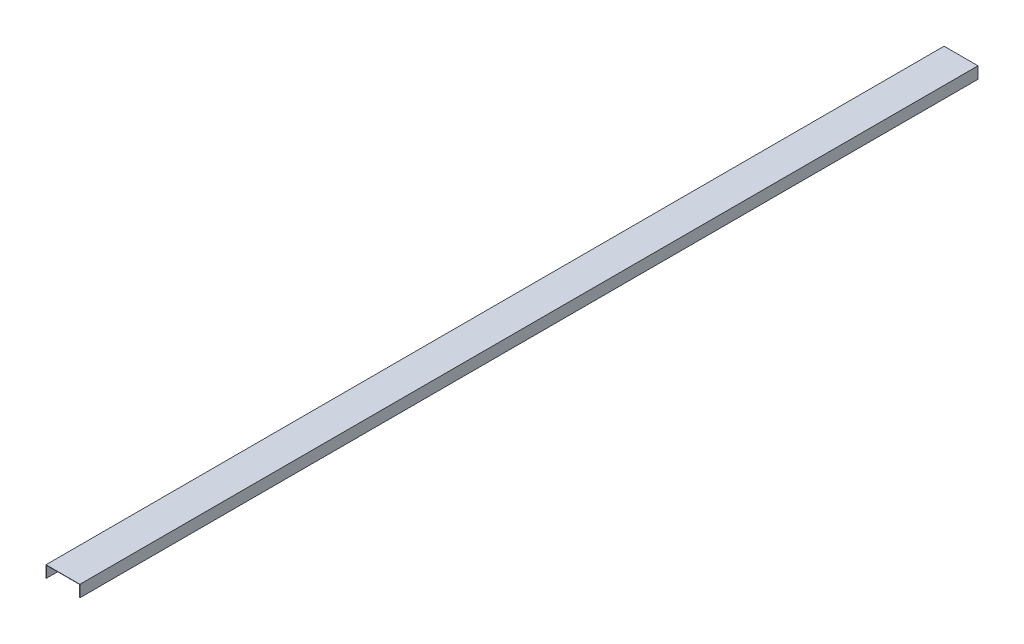
ISO-10303-21;
HEADER;
FILE_DESCRIPTION(('STEP AP214'),'2;1');
FILE_NAME('part.step','',(''),(''),'','','');
FILE_SCHEMA(('AUTOMOTIVE_DESIGN { 1 0 10303 214 1 1 1 1 }'));
ENDSEC;
DATA;
#1=APPLICATION_CONTEXT('core data for automotive mechanical design processes');
#2=APPLICATION_PROTOCOL_DEFINITION('international standard','automotive_design',2000,#1);
#3=PRODUCT_CONTEXT('',#1,'mechanical');
#4=PRODUCT('Part','Part','',(#3));
#5=PRODUCT_RELATED_PRODUCT_CATEGORY('part','',(#4));
#6=PRODUCT_DEFINITION_FORMATION('','',#4);
#7=PRODUCT_DEFINITION_CONTEXT('part definition',#1,'design');
#8=PRODUCT_DEFINITION('design','',#6,#7);
#9=PRODUCT_DEFINITION_SHAPE('','',#8);
#10=(LENGTH_UNIT() NAMED_UNIT(*) SI_UNIT(.MILLI.,.METRE.));
#11=(NAMED_UNIT(*) PLANE_ANGLE_UNIT() SI_UNIT($,.RADIAN.));
#12=(NAMED_UNIT(*) SI_UNIT($,.STERADIAN.) SOLID_ANGLE_UNIT());
#13=UNCERTAINTY_MEASURE_WITH_UNIT(LENGTH_MEASURE(1.E-05),#10,'distance_accuracy_value','');
#14=(GEOMETRIC_REPRESENTATION_CONTEXT(3) GLOBAL_UNCERTAINTY_ASSIGNED_CONTEXT((#13)) GLOBAL_UNIT_ASSIGNED_CONTEXT((#10,
#11,#12)) REPRESENTATION_CONTEXT('',''));
#15=CARTESIAN_POINT('',(0.,0.,0.));
#16=DIRECTION('',(0.,0.,1.));
#17=DIRECTION('',(1.,0.,0.));
#18=AXIS2_PLACEMENT_3D('',#15,#16,#17);
#19=CARTESIAN_POINT('',(-46.0375000000002,31.75,-1219.2));
#20=DIRECTION('',(0.,0.,1.));
#21=DIRECTION('',(1.,0.,0.));
#22=AXIS2_PLACEMENT_3D('',#19,#20,#21);
#23=PLANE('',#22);
#24=DIRECTION('',(0.,-1.,0.));
#25=VECTOR('',#24,1.);
#26=CARTESIAN_POINT('',(45.2755000000002,30.988,-1219.2));
#27=LINE('',#26,#25);
#28=CARTESIAN_POINT('',(45.2755000000002,30.988,-1219.2));
#29=VERTEX_POINT('',#28);
#30=CARTESIAN_POINT('',(45.2755000000002,0.,-1219.2));
#31=VERTEX_POINT('',#30);
#32=EDGE_CURVE('E119',#29,#31,#27,.T.);
#33=ORIENTED_EDGE('',*,*,#32,.F.);
#34=DIRECTION('',(-1.,0.,0.));
#35=VECTOR('',#34,1.);
#36=CARTESIAN_POINT('',(-45.2755000000002,30.988,-1219.2));
#37=LINE('',#36,#35);
#38=CARTESIAN_POINT('',(-45.2755000000002,30.988,-1219.2));
#39=VERTEX_POINT('',#38);
#40=EDGE_CURVE('E107',#29,#39,#37,.T.);
#41=ORIENTED_EDGE('',*,*,#40,.T.);
#42=DIRECTION('',(0.,-1.,0.));
#43=VECTOR('',#42,1.);
#44=CARTESIAN_POINT('',(-45.2755000000002,30.988,-1219.2));
#45=LINE('',#44,#43);
#46=CARTESIAN_POINT('',(-45.2755000000002,0.,-1219.2));
#47=VERTEX_POINT('',#46);
#48=EDGE_CURVE('E127',#39,#47,#45,.T.);
#49=ORIENTED_EDGE('',*,*,#48,.T.);
#50=DIRECTION('',(-1.,0.,0.));
#51=VECTOR('',#50,1.);
#52=CARTESIAN_POINT('',(-46.0375000000002,0.,-1219.2));
#53=LINE('',#52,#51);
#54=CARTESIAN_POINT('',(-46.0375000000002,0.,-1219.2));
#55=VERTEX_POINT('',#54);
#56=EDGE_CURVE('E130',#47,#55,#53,.T.);
#57=ORIENTED_EDGE('',*,*,#56,.T.);
#58=DIRECTION('',(0.,-1.,0.));
#59=VECTOR('',#58,1.);
#60=CARTESIAN_POINT('',(-46.0375000000002,31.75,-1219.2));
#61=LINE('',#60,#59);
#62=CARTESIAN_POINT('',(-46.0375000000002,31.75,-1219.2));
#63=VERTEX_POINT('',#62);
#64=EDGE_CURVE('E40',#63,#55,#61,.T.);
#65=ORIENTED_EDGE('',*,*,#64,.F.);
#66=DIRECTION('',(-1.,0.,0.));
#67=VECTOR('',#66,1.);
#68=CARTESIAN_POINT('',(-46.0375000000002,31.75,-1219.2));
#69=LINE('',#68,#67);
#70=CARTESIAN_POINT('',(46.0374999999999,31.75,-1219.2));
#71=VERTEX_POINT('',#70);
#72=EDGE_CURVE('E84',#71,#63,#69,.T.);
#73=ORIENTED_EDGE('',*,*,#72,.F.);
#74=DIRECTION('',(0.,-1.,0.));
#75=VECTOR('',#74,1.);
#76=CARTESIAN_POINT('',(46.0374999999999,31.75,-1219.2));
#77=LINE('',#76,#75);
#78=CARTESIAN_POINT('',(46.0374999999999,0.,-1219.2));
#79=VERTEX_POINT('',#78);
#80=EDGE_CURVE('E11',#71,#79,#77,.T.);
#81=ORIENTED_EDGE('',*,*,#80,.T.);
#82=EDGE_CURVE('E125',#79,#31,#53,.T.);
#83=ORIENTED_EDGE('',*,*,#82,.T.);
#84=EDGE_LOOP('',(#33,#41,#49,#57,#65,#73,#81,#83));
#85=FACE_BOUND('',#84,.T.);
#86=ADVANCED_FACE('F32',(#85),#23,.F.);
#87=CARTESIAN_POINT('',(-46.0374999999999,31.75,1219.2));
#88=DIRECTION('',(0.,0.,-1.));
#89=DIRECTION('',(-1.,0.,0.));
#90=AXIS2_PLACEMENT_3D('',#87,#88,#89);
#91=PLANE('',#90);
#92=DIRECTION('',(0.,-1.,0.));
#93=VECTOR('',#92,1.);
#94=CARTESIAN_POINT('',(45.2755000000002,30.988,1219.2));
#95=LINE('',#94,#93);
#96=CARTESIAN_POINT('',(45.2755000000002,30.988,1219.2));
#97=VERTEX_POINT('',#96);
#98=CARTESIAN_POINT('',(45.2755000000002,0.,1219.2));
#99=VERTEX_POINT('',#98);
#100=EDGE_CURVE('E121',#97,#99,#95,.T.);
#101=ORIENTED_EDGE('',*,*,#100,.T.);
#102=DIRECTION('',(1.,0.,0.));
#103=VECTOR('',#102,1.);
#104=CARTESIAN_POINT('',(-46.0374999999999,0.,1219.2));
#105=LINE('',#104,#103);
#106=CARTESIAN_POINT('',(46.0375000000002,0.,1219.2));
#107=VERTEX_POINT('',#106);
#108=EDGE_CURVE('E77',#99,#107,#105,.T.);
#109=ORIENTED_EDGE('',*,*,#108,.T.);
#110=DIRECTION('',(0.,-1.,0.));
#111=VECTOR('',#110,1.);
#112=CARTESIAN_POINT('',(46.0375000000002,31.75,1219.2));
#113=LINE('',#112,#111);
#114=CARTESIAN_POINT('',(46.0375000000002,31.75,1219.2));
#115=VERTEX_POINT('',#114);
#116=EDGE_CURVE('E141',#115,#107,#113,.T.);
#117=ORIENTED_EDGE('',*,*,#116,.F.);
#118=DIRECTION('',(1.,0.,0.));
#119=VECTOR('',#118,1.);
#120=CARTESIAN_POINT('',(-46.0374999999999,31.75,1219.2));
#121=LINE('',#120,#119);
#122=CARTESIAN_POINT('',(-46.0374999999999,31.75,1219.2));
#123=VERTEX_POINT('',#122);
#124=EDGE_CURVE('E56',#123,#115,#121,.T.);
#125=ORIENTED_EDGE('',*,*,#124,.F.);
#126=DIRECTION('',(0.,-1.,0.));
#127=VECTOR('',#126,1.);
#128=CARTESIAN_POINT('',(-46.0374999999999,31.75,1219.2));
#129=LINE('',#128,#127);
#130=CARTESIAN_POINT('',(-46.0374999999999,0.,1219.2));
#131=VERTEX_POINT('',#130);
#132=EDGE_CURVE('E149',#123,#131,#129,.T.);
#133=ORIENTED_EDGE('',*,*,#132,.T.);
#134=CARTESIAN_POINT('',(-45.2755000000002,0.,1219.2));
#135=VERTEX_POINT('',#134);
#136=EDGE_CURVE('E137',#131,#135,#105,.T.);
#137=ORIENTED_EDGE('',*,*,#136,.T.);
#138=DIRECTION('',(0.,-1.,0.));
#139=VECTOR('',#138,1.);
#140=CARTESIAN_POINT('',(-45.2755000000002,30.988,1219.2));
#141=LINE('',#140,#139);
#142=CARTESIAN_POINT('',(-45.2755000000002,30.988,1219.2));
#143=VERTEX_POINT('',#142);
#144=EDGE_CURVE('E47',#143,#135,#141,.T.);
#145=ORIENTED_EDGE('',*,*,#144,.F.);
#146=DIRECTION('',(1.,0.,0.));
#147=VECTOR('',#146,1.);
#148=CARTESIAN_POINT('',(-45.2755000000002,30.988,1219.2));
#149=LINE('',#148,#147);
#150=EDGE_CURVE('E192',#143,#97,#149,.T.);
#151=ORIENTED_EDGE('',*,*,#150,.T.);
#152=EDGE_LOOP('',(#101,#109,#117,#125,#133,#137,#145,#151));
#153=FACE_BOUND('',#152,.T.);
#154=ADVANCED_FACE('F161',(#153),#91,.F.);
#155=CARTESIAN_POINT('',(0.,0.,0.));
#156=DIRECTION('',(0.,1.,0.));
#157=DIRECTION('',(0.,0.,1.));
#158=AXIS2_PLACEMENT_3D('',#155,#156,#157);
#159=PLANE('',#158);
#160=DIRECTION('',(0.,0.,-1.));
#161=VECTOR('',#160,1.);
#162=CARTESIAN_POINT('',(45.2755000000002,0.,-1219.2));
#163=LINE('',#162,#161);
#164=EDGE_CURVE('E188',#99,#31,#163,.T.);
#165=ORIENTED_EDGE('',*,*,#164,.T.);
#166=ORIENTED_EDGE('',*,*,#82,.F.);
#167=DIRECTION('',(0.,0.,-1.));
#168=VECTOR('',#167,1.);
#169=CARTESIAN_POINT('',(46.0374999999999,0.,-1219.2));
#170=LINE('',#169,#168);
#171=EDGE_CURVE('E126',#107,#79,#170,.T.);
#172=ORIENTED_EDGE('',*,*,#171,.F.);
#173=ORIENTED_EDGE('',*,*,#108,.F.);
#174=EDGE_LOOP('',(#165,#166,#172,#173));
#175=FACE_BOUND('',#174,.T.);
#176=ADVANCED_FACE('F181',(#175),#159,.F.);
#177=DIRECTION('',(0.,0.,1.));
#178=VECTOR('',#177,1.);
#179=CARTESIAN_POINT('',(-45.2755000000002,0.,-1219.2));
#180=LINE('',#179,#178);
#181=EDGE_CURVE('E122',#47,#135,#180,.T.);
#182=ORIENTED_EDGE('',*,*,#181,.T.);
#183=ORIENTED_EDGE('',*,*,#136,.F.);
#184=DIRECTION('',(0.,0.,1.));
#185=VECTOR('',#184,1.);
#186=CARTESIAN_POINT('',(-46.0375000000002,0.,-1219.2));
#187=LINE('',#186,#185);
#188=EDGE_CURVE('E144',#55,#131,#187,.T.);
#189=ORIENTED_EDGE('',*,*,#188,.F.);
#190=ORIENTED_EDGE('',*,*,#56,.F.);
#191=EDGE_LOOP('',(#182,#183,#189,#190));
#192=FACE_BOUND('',#191,.T.);
#193=ADVANCED_FACE('F160',(#192),#159,.F.);
#194=CARTESIAN_POINT('',(46.0374999999999,31.75,-1219.2));
#195=DIRECTION('',(-1.,0.,0.));
#196=DIRECTION('',(0.,0.,1.));
#197=AXIS2_PLACEMENT_3D('',#194,#195,#196);
#198=PLANE('',#197);
#199=ORIENTED_EDGE('',*,*,#171,.T.);
#200=ORIENTED_EDGE('',*,*,#80,.F.);
#201=DIRECTION('',(0.,0.,-1.));
#202=VECTOR('',#201,1.);
#203=CARTESIAN_POINT('',(46.0374999999999,31.75,-1219.2));
#204=LINE('',#203,#202);
#205=EDGE_CURVE('E135',#115,#71,#204,.T.);
#206=ORIENTED_EDGE('',*,*,#205,.F.);
#207=ORIENTED_EDGE('',*,*,#116,.T.);
#208=EDGE_LOOP('',(#199,#200,#206,#207));
#209=FACE_BOUND('',#208,.T.);
#210=ADVANCED_FACE('F34',(#209),#198,.F.);
#211=CARTESIAN_POINT('',(-46.0375000000002,31.75,-1219.2));
#212=DIRECTION('',(1.,0.,0.));
#213=DIRECTION('',(0.,0.,-1.));
#214=AXIS2_PLACEMENT_3D('',#211,#212,#213);
#215=PLANE('',#214);
#216=ORIENTED_EDGE('',*,*,#188,.T.);
#217=ORIENTED_EDGE('',*,*,#132,.F.);
#218=DIRECTION('',(0.,0.,1.));
#219=VECTOR('',#218,1.);
#220=CARTESIAN_POINT('',(-46.0375000000002,31.75,-1219.2));
#221=LINE('',#220,#219);
#222=EDGE_CURVE('E139',#63,#123,#221,.T.);
#223=ORIENTED_EDGE('',*,*,#222,.F.);
#224=ORIENTED_EDGE('',*,*,#64,.T.);
#225=EDGE_LOOP('',(#216,#217,#223,#224));
#226=FACE_BOUND('',#225,.T.);
#227=ADVANCED_FACE('F155',(#226),#215,.F.);
#228=CARTESIAN_POINT('',(0.,31.75,0.));
#229=DIRECTION('',(0.,1.,0.));
#230=DIRECTION('',(0.,0.,1.));
#231=AXIS2_PLACEMENT_3D('',#228,#229,#230);
#232=PLANE('',#231);
#233=ORIENTED_EDGE('',*,*,#205,.T.);
#234=ORIENTED_EDGE('',*,*,#72,.T.);
#235=ORIENTED_EDGE('',*,*,#222,.T.);
#236=ORIENTED_EDGE('',*,*,#124,.T.);
#237=EDGE_LOOP('',(#233,#234,#235,#236));
#238=FACE_BOUND('',#237,.T.);
#239=ADVANCED_FACE('F166',(#238),#232,.T.);
#240=CARTESIAN_POINT('',(45.2755000000002,30.988,-1219.2));
#241=DIRECTION('',(-1.,0.,0.));
#242=DIRECTION('',(0.,0.,1.));
#243=AXIS2_PLACEMENT_3D('',#240,#241,#242);
#244=PLANE('',#243);
#245=ORIENTED_EDGE('',*,*,#164,.F.);
#246=ORIENTED_EDGE('',*,*,#100,.F.);
#247=DIRECTION('',(0.,0.,-1.));
#248=VECTOR('',#247,1.);
#249=CARTESIAN_POINT('',(45.2755000000002,30.988,-1219.2));
#250=LINE('',#249,#248);
#251=EDGE_CURVE('E111',#97,#29,#250,.T.);
#252=ORIENTED_EDGE('',*,*,#251,.T.);
#253=ORIENTED_EDGE('',*,*,#32,.T.);
#254=EDGE_LOOP('',(#245,#246,#252,#253));
#255=FACE_BOUND('',#254,.T.);
#256=ADVANCED_FACE('F118',(#255),#244,.T.);
#257=CARTESIAN_POINT('',(-45.2755000000002,30.988,-1219.2));
#258=DIRECTION('',(1.,0.,0.));
#259=DIRECTION('',(0.,0.,-1.));
#260=AXIS2_PLACEMENT_3D('',#257,#258,#259);
#261=PLANE('',#260);
#262=ORIENTED_EDGE('',*,*,#181,.F.);
#263=ORIENTED_EDGE('',*,*,#48,.F.);
#264=DIRECTION('',(0.,0.,1.));
#265=VECTOR('',#264,1.);
#266=CARTESIAN_POINT('',(-45.2755000000002,30.988,-1219.2));
#267=LINE('',#266,#265);
#268=EDGE_CURVE('E113',#39,#143,#267,.T.);
#269=ORIENTED_EDGE('',*,*,#268,.T.);
#270=ORIENTED_EDGE('',*,*,#144,.T.);
#271=EDGE_LOOP('',(#262,#263,#269,#270));
#272=FACE_BOUND('',#271,.T.);
#273=ADVANCED_FACE('F173',(#272),#261,.T.);
#274=CARTESIAN_POINT('',(0.,30.988,0.));
#275=DIRECTION('',(0.,1.,0.));
#276=DIRECTION('',(0.,0.,1.));
#277=AXIS2_PLACEMENT_3D('',#274,#275,#276);
#278=PLANE('',#277);
#279=ORIENTED_EDGE('',*,*,#251,.F.);
#280=ORIENTED_EDGE('',*,*,#150,.F.);
#281=ORIENTED_EDGE('',*,*,#268,.F.);
#282=ORIENTED_EDGE('',*,*,#40,.F.);
#283=EDGE_LOOP('',(#279,#280,#281,#282));
#284=FACE_BOUND('',#283,.T.);
#285=ADVANCED_FACE('F109',(#284),#278,.F.);
#286=CLOSED_SHELL('',(#86,#154,#176,#193,#210,#227,#239,#256,#273,#285));
#287=MANIFOLD_SOLID_BREP('B2',#286);
#288=ADVANCED_BREP_SHAPE_REPRESENTATION('',(#18,#287),#14);
#289=SHAPE_DEFINITION_REPRESENTATION(#9,#288);
ENDSEC;
END-ISO-10303-21;
